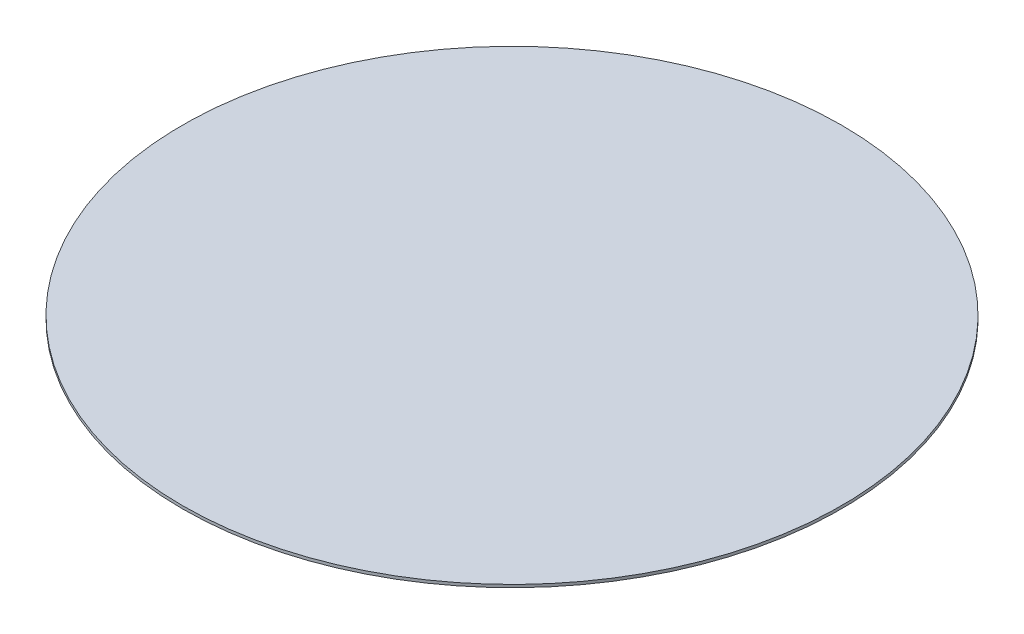
ISO-10303-21;
HEADER;
FILE_DESCRIPTION(('STEP AP214'),'2;1');
FILE_NAME('part.step','',(''),(''),'','','');
FILE_SCHEMA(('AUTOMOTIVE_DESIGN { 1 0 10303 214 1 1 1 1 }'));
ENDSEC;
DATA;
#1=APPLICATION_CONTEXT('core data for automotive mechanical design processes');
#2=APPLICATION_PROTOCOL_DEFINITION('international standard','automotive_design',2000,#1);
#3=PRODUCT_CONTEXT('',#1,'mechanical');
#4=PRODUCT('Part','Part','',(#3));
#5=PRODUCT_RELATED_PRODUCT_CATEGORY('part','',(#4));
#6=PRODUCT_DEFINITION_FORMATION('','',#4);
#7=PRODUCT_DEFINITION_CONTEXT('part definition',#1,'design');
#8=PRODUCT_DEFINITION('design','',#6,#7);
#9=PRODUCT_DEFINITION_SHAPE('','',#8);
#10=(LENGTH_UNIT() NAMED_UNIT(*) SI_UNIT(.MILLI.,.METRE.));
#11=(NAMED_UNIT(*) PLANE_ANGLE_UNIT() SI_UNIT($,.RADIAN.));
#12=(NAMED_UNIT(*) SI_UNIT($,.STERADIAN.) SOLID_ANGLE_UNIT());
#13=UNCERTAINTY_MEASURE_WITH_UNIT(LENGTH_MEASURE(1.E-05),#10,'distance_accuracy_value','');
#14=(GEOMETRIC_REPRESENTATION_CONTEXT(3) GLOBAL_UNCERTAINTY_ASSIGNED_CONTEXT((#13)) GLOBAL_UNIT_ASSIGNED_CONTEXT((#10,
#11,#12)) REPRESENTATION_CONTEXT('',''));
#15=CARTESIAN_POINT('',(0.,0.,0.));
#16=DIRECTION('',(0.,0.,1.));
#17=DIRECTION('',(1.,0.,0.));
#18=AXIS2_PLACEMENT_3D('',#15,#16,#17);
#19=CARTESIAN_POINT('',(0.,15.,0.));
#20=DIRECTION('',(0.,-1.,0.));
#21=DIRECTION('',(0.,0.,-1.));
#22=AXIS2_PLACEMENT_3D('',#19,#20,#21);
#23=CYLINDRICAL_SURFACE('',#22,1750.);
#24=CARTESIAN_POINT('',(0.,15.,0.));
#25=DIRECTION('',(0.,1.,0.));
#26=DIRECTION('',(0.,0.,1.));
#27=AXIS2_PLACEMENT_3D('',#24,#25,#26);
#28=CIRCLE('',#27,1750.);
#29=CARTESIAN_POINT('',(0.,15.,1750.));
#30=VERTEX_POINT('',#29);
#31=EDGE_CURVE('E10',#30,#30,#28,.T.);
#32=ORIENTED_EDGE('',*,*,#31,.F.);
#33=EDGE_LOOP('',(#32));
#34=FACE_BOUND('',#33,.T.);
#35=CARTESIAN_POINT('',(0.,0.,0.));
#36=DIRECTION('',(0.,1.,0.));
#37=DIRECTION('',(0.,0.,1.));
#38=AXIS2_PLACEMENT_3D('',#35,#36,#37);
#39=CIRCLE('',#38,1750.);
#40=CARTESIAN_POINT('',(0.,0.,1750.));
#41=VERTEX_POINT('',#40);
#42=EDGE_CURVE('E35',#41,#41,#39,.T.);
#43=ORIENTED_EDGE('',*,*,#42,.T.);
#44=EDGE_LOOP('',(#43));
#45=FACE_BOUND('',#44,.T.);
#46=ADVANCED_FACE('F32',(#34,#45),#23,.T.);
#47=CARTESIAN_POINT('',(0.,15.,0.));
#48=DIRECTION('',(0.,1.,0.));
#49=DIRECTION('',(0.,0.,1.));
#50=AXIS2_PLACEMENT_3D('',#47,#48,#49);
#51=PLANE('',#50);
#52=ORIENTED_EDGE('',*,*,#31,.T.);
#53=EDGE_LOOP('',(#52));
#54=FACE_BOUND('',#53,.T.);
#55=ADVANCED_FACE('F47',(#54),#51,.T.);
#56=CARTESIAN_POINT('',(0.,0.,0.));
#57=DIRECTION('',(0.,1.,0.));
#58=DIRECTION('',(0.,0.,1.));
#59=AXIS2_PLACEMENT_3D('',#56,#57,#58);
#60=PLANE('',#59);
#61=ORIENTED_EDGE('',*,*,#42,.F.);
#62=EDGE_LOOP('',(#61));
#63=FACE_BOUND('',#62,.T.);
#64=ADVANCED_FACE('F45',(#63),#60,.F.);
#65=CLOSED_SHELL('',(#46,#55,#64));
#66=MANIFOLD_SOLID_BREP('B2',#65);
#67=ADVANCED_BREP_SHAPE_REPRESENTATION('',(#18,#66),#14);
#68=SHAPE_DEFINITION_REPRESENTATION(#9,#67);
ENDSEC;
END-ISO-10303-21;
